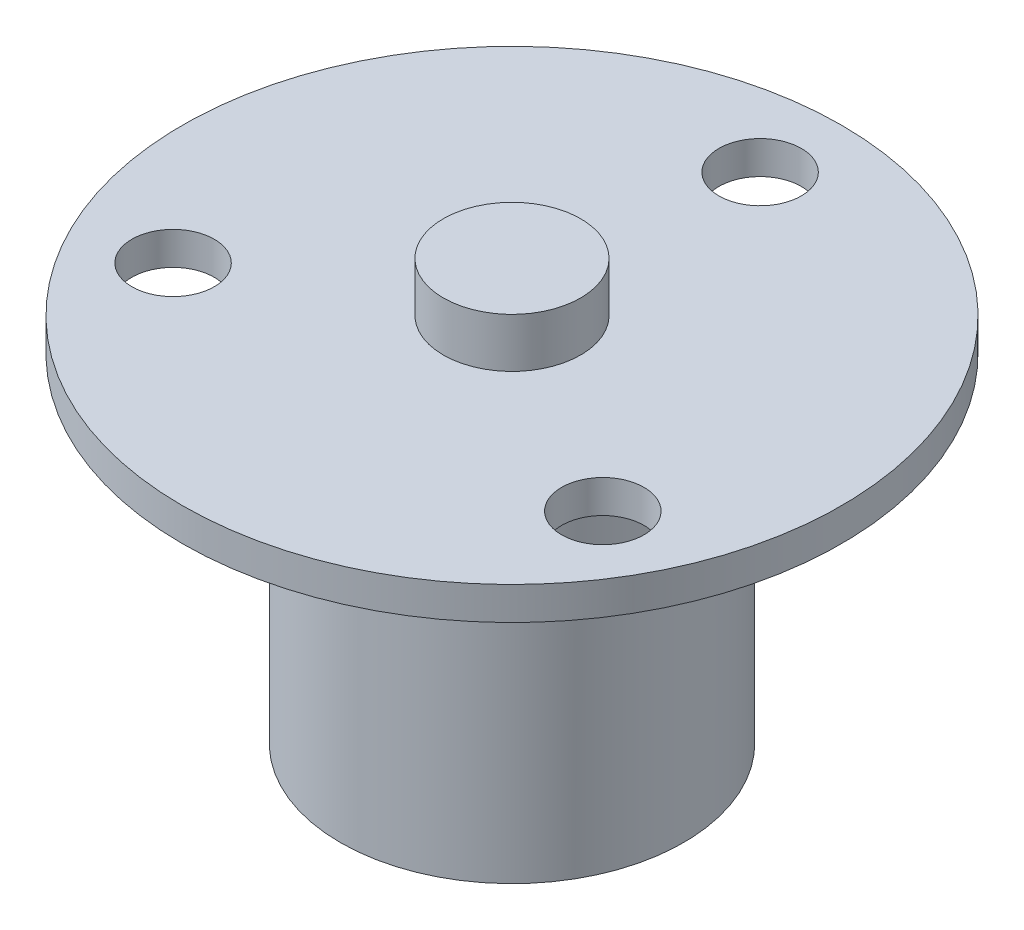
ISO-10303-21;
HEADER;
FILE_DESCRIPTION(('STEP AP214'),'2;1');
FILE_NAME('part.step','',(''),(''),'','','');
FILE_SCHEMA(('AUTOMOTIVE_DESIGN { 1 0 10303 214 1 1 1 1 }'));
ENDSEC;
DATA;
#1=APPLICATION_CONTEXT('core data for automotive mechanical design processes');
#2=APPLICATION_PROTOCOL_DEFINITION('international standard','automotive_design',2000,#1);
#3=PRODUCT_CONTEXT('',#1,'mechanical');
#4=PRODUCT('Part','Part','',(#3));
#5=PRODUCT_RELATED_PRODUCT_CATEGORY('part','',(#4));
#6=PRODUCT_DEFINITION_FORMATION('','',#4);
#7=PRODUCT_DEFINITION_CONTEXT('part definition',#1,'design');
#8=PRODUCT_DEFINITION('design','',#6,#7);
#9=PRODUCT_DEFINITION_SHAPE('','',#8);
#10=(LENGTH_UNIT() NAMED_UNIT(*) SI_UNIT(.MILLI.,.METRE.));
#11=(NAMED_UNIT(*) PLANE_ANGLE_UNIT() SI_UNIT($,.RADIAN.));
#12=(NAMED_UNIT(*) SI_UNIT($,.STERADIAN.) SOLID_ANGLE_UNIT());
#13=UNCERTAINTY_MEASURE_WITH_UNIT(LENGTH_MEASURE(1.E-05),#10,'distance_accuracy_value','');
#14=(GEOMETRIC_REPRESENTATION_CONTEXT(3) GLOBAL_UNCERTAINTY_ASSIGNED_CONTEXT((#13)) GLOBAL_UNIT_ASSIGNED_CONTEXT((#10,
#11,#12)) REPRESENTATION_CONTEXT('',''));
#15=CARTESIAN_POINT('',(0.,0.,0.));
#16=DIRECTION('',(0.,0.,1.));
#17=DIRECTION('',(1.,0.,0.));
#18=AXIS2_PLACEMENT_3D('',#15,#16,#17);
#19=CARTESIAN_POINT('',(0.,1.2,0.));
#20=DIRECTION('',(0.,1.,0.));
#21=DIRECTION('',(0.,0.,1.));
#22=AXIS2_PLACEMENT_3D('',#19,#20,#21);
#23=PLANE('',#22);
#24=CARTESIAN_POINT('',(-7.82407967333507,1.2,4.51723450556106));
#25=DIRECTION('',(0.,1.,0.));
#26=DIRECTION('',(0.,0.,1.));
#27=AXIS2_PLACEMENT_3D('',#24,#25,#26);
#28=CIRCLE('',#27,1.5);
#29=CARTESIAN_POINT('',(-7.82407967333507,1.2,6.01723450556106));
#30=VERTEX_POINT('',#29);
#31=EDGE_CURVE('E63',#30,#30,#28,.T.);
#32=ORIENTED_EDGE('',*,*,#31,.F.);
#33=EDGE_LOOP('',(#32));
#34=FACE_BOUND('',#33,.T.);
#35=CARTESIAN_POINT('',(7.82407967333507,1.2,4.51723450556105));
#36=DIRECTION('',(0.,1.,0.));
#37=DIRECTION('',(0.,0.,1.));
#38=AXIS2_PLACEMENT_3D('',#35,#36,#37);
#39=CIRCLE('',#38,1.5);
#40=CARTESIAN_POINT('',(7.82407967333507,1.2,6.01723450556105));
#41=VERTEX_POINT('',#40);
#42=EDGE_CURVE('E57',#41,#41,#39,.T.);
#43=ORIENTED_EDGE('',*,*,#42,.F.);
#44=EDGE_LOOP('',(#43));
#45=FACE_BOUND('',#44,.T.);
#46=CARTESIAN_POINT('',(0.,1.2,-9.03446901112215));
#47=DIRECTION('',(0.,1.,0.));
#48=DIRECTION('',(0.,0.,1.));
#49=AXIS2_PLACEMENT_3D('',#46,#47,#48);
#50=CIRCLE('',#49,1.5);
#51=CARTESIAN_POINT('',(0.,1.2,-7.53446901112215));
#52=VERTEX_POINT('',#51);
#53=EDGE_CURVE('E51',#52,#52,#50,.T.);
#54=ORIENTED_EDGE('',*,*,#53,.F.);
#55=EDGE_LOOP('',(#54));
#56=FACE_BOUND('',#55,.T.);
#57=CARTESIAN_POINT('',(0.,1.2,0.));
#58=DIRECTION('',(0.,1.,0.));
#59=DIRECTION('',(0.,0.,1.));
#60=AXIS2_PLACEMENT_3D('',#57,#58,#59);
#61=CIRCLE('',#60,12.);
#62=CARTESIAN_POINT('',(0.,1.2,12.));
#63=VERTEX_POINT('',#62);
#64=EDGE_CURVE('E37',#63,#63,#61,.T.);
#65=ORIENTED_EDGE('',*,*,#64,.T.);
#66=EDGE_LOOP('',(#65));
#67=FACE_BOUND('',#66,.T.);
#68=CARTESIAN_POINT('',(0.,1.2,0.));
#69=DIRECTION('',(0.,1.,0.));
#70=DIRECTION('',(0.,0.,1.));
#71=AXIS2_PLACEMENT_3D('',#68,#69,#70);
#72=CIRCLE('',#71,2.5);
#73=CARTESIAN_POINT('',(0.,1.2,2.5));
#74=VERTEX_POINT('',#73);
#75=EDGE_CURVE('E46',#74,#74,#72,.T.);
#76=ORIENTED_EDGE('',*,*,#75,.F.);
#77=EDGE_LOOP('',(#76));
#78=FACE_BOUND('',#77,.T.);
#79=ADVANCED_FACE('F30',(#34,#45,#56,#67,#78),#23,.T.);
#80=CARTESIAN_POINT('',(0.,0.,0.));
#81=DIRECTION('',(0.,1.,0.));
#82=DIRECTION('',(0.,0.,1.));
#83=AXIS2_PLACEMENT_3D('',#80,#81,#82);
#84=PLANE('',#83);
#85=CARTESIAN_POINT('',(0.,0.,0.));
#86=DIRECTION('',(0.,1.,0.));
#87=DIRECTION('',(0.,0.,1.));
#88=AXIS2_PLACEMENT_3D('',#85,#86,#87);
#89=CIRCLE('',#88,6.25);
#90=CARTESIAN_POINT('',(0.,0.,6.25));
#91=VERTEX_POINT('',#90);
#92=EDGE_CURVE('E10',#91,#91,#89,.F.);
#93=ORIENTED_EDGE('',*,*,#92,.F.);
#94=EDGE_LOOP('',(#93));
#95=FACE_BOUND('',#94,.T.);
#96=CARTESIAN_POINT('',(-7.82407967333507,0.,4.51723450556106));
#97=DIRECTION('',(0.,1.,0.));
#98=DIRECTION('',(0.,0.,1.));
#99=AXIS2_PLACEMENT_3D('',#96,#97,#98);
#100=CIRCLE('',#99,1.5);
#101=CARTESIAN_POINT('',(-7.82407967333507,0.,6.01723450556106));
#102=VERTEX_POINT('',#101);
#103=EDGE_CURVE('E60',#102,#102,#100,.T.);
#104=ORIENTED_EDGE('',*,*,#103,.T.);
#105=EDGE_LOOP('',(#104));
#106=FACE_BOUND('',#105,.T.);
#107=CARTESIAN_POINT('',(7.82407967333507,0.,4.51723450556105));
#108=DIRECTION('',(0.,1.,0.));
#109=DIRECTION('',(0.,0.,1.));
#110=AXIS2_PLACEMENT_3D('',#107,#108,#109);
#111=CIRCLE('',#110,1.5);
#112=CARTESIAN_POINT('',(7.82407967333507,0.,6.01723450556105));
#113=VERTEX_POINT('',#112);
#114=EDGE_CURVE('E54',#113,#113,#111,.T.);
#115=ORIENTED_EDGE('',*,*,#114,.T.);
#116=EDGE_LOOP('',(#115));
#117=FACE_BOUND('',#116,.T.);
#118=CARTESIAN_POINT('',(0.,0.,-9.03446901112215));
#119=DIRECTION('',(0.,1.,0.));
#120=DIRECTION('',(0.,0.,1.));
#121=AXIS2_PLACEMENT_3D('',#118,#119,#120);
#122=CIRCLE('',#121,1.5);
#123=CARTESIAN_POINT('',(0.,0.,-7.53446901112215));
#124=VERTEX_POINT('',#123);
#125=EDGE_CURVE('E50',#124,#124,#122,.T.);
#126=ORIENTED_EDGE('',*,*,#125,.T.);
#127=EDGE_LOOP('',(#126));
#128=FACE_BOUND('',#127,.T.);
#129=CARTESIAN_POINT('',(0.,0.,0.));
#130=DIRECTION('',(0.,1.,0.));
#131=DIRECTION('',(0.,0.,1.));
#132=AXIS2_PLACEMENT_3D('',#129,#130,#131);
#133=CIRCLE('',#132,12.);
#134=CARTESIAN_POINT('',(0.,0.,12.));
#135=VERTEX_POINT('',#134);
#136=EDGE_CURVE('E41',#135,#135,#133,.T.);
#137=ORIENTED_EDGE('',*,*,#136,.F.);
#138=EDGE_LOOP('',(#137));
#139=FACE_BOUND('',#138,.T.);
#140=ADVANCED_FACE('F91',(#95,#106,#117,#128,#139),#84,.F.);
#141=CARTESIAN_POINT('',(0.,1.2,0.));
#142=DIRECTION('',(0.,-1.,0.));
#143=DIRECTION('',(0.,0.,-1.));
#144=AXIS2_PLACEMENT_3D('',#141,#142,#143);
#145=CYLINDRICAL_SURFACE('',#144,12.);
#146=ORIENTED_EDGE('',*,*,#64,.F.);
#147=EDGE_LOOP('',(#146));
#148=FACE_BOUND('',#147,.T.);
#149=ORIENTED_EDGE('',*,*,#136,.T.);
#150=EDGE_LOOP('',(#149));
#151=FACE_BOUND('',#150,.T.);
#152=ADVANCED_FACE('F32',(#148,#151),#145,.T.);
#153=CARTESIAN_POINT('',(0.,0.,-9.03446901112215));
#154=DIRECTION('',(0.,1.,0.));
#155=DIRECTION('',(0.,0.,1.));
#156=AXIS2_PLACEMENT_3D('',#153,#154,#155);
#157=CYLINDRICAL_SURFACE('',#156,1.5);
#158=ORIENTED_EDGE('',*,*,#125,.F.);
#159=EDGE_LOOP('',(#158));
#160=FACE_BOUND('',#159,.T.);
#161=ORIENTED_EDGE('',*,*,#53,.T.);
#162=EDGE_LOOP('',(#161));
#163=FACE_BOUND('',#162,.T.);
#164=ADVANCED_FACE('F101',(#160,#163),#157,.F.);
#165=CARTESIAN_POINT('',(7.82407967333507,0.,4.51723450556105));
#166=DIRECTION('',(0.,1.,0.));
#167=DIRECTION('',(0.,0.,1.));
#168=AXIS2_PLACEMENT_3D('',#165,#166,#167);
#169=CYLINDRICAL_SURFACE('',#168,1.5);
#170=ORIENTED_EDGE('',*,*,#114,.F.);
#171=EDGE_LOOP('',(#170));
#172=FACE_BOUND('',#171,.T.);
#173=ORIENTED_EDGE('',*,*,#42,.T.);
#174=EDGE_LOOP('',(#173));
#175=FACE_BOUND('',#174,.T.);
#176=ADVANCED_FACE('F104',(#172,#175),#169,.F.);
#177=CARTESIAN_POINT('',(-7.82407967333507,0.,4.51723450556106));
#178=DIRECTION('',(0.,1.,0.));
#179=DIRECTION('',(0.,0.,1.));
#180=AXIS2_PLACEMENT_3D('',#177,#178,#179);
#181=CYLINDRICAL_SURFACE('',#180,1.5);
#182=ORIENTED_EDGE('',*,*,#103,.F.);
#183=EDGE_LOOP('',(#182));
#184=FACE_BOUND('',#183,.T.);
#185=ORIENTED_EDGE('',*,*,#31,.T.);
#186=EDGE_LOOP('',(#185));
#187=FACE_BOUND('',#186,.T.);
#188=ADVANCED_FACE('F108',(#184,#187),#181,.F.);
#189=CARTESIAN_POINT('',(0.,-12.3,0.));
#190=DIRECTION('',(0.,1.,0.));
#191=DIRECTION('',(0.,0.,1.));
#192=AXIS2_PLACEMENT_3D('',#189,#190,#191);
#193=CYLINDRICAL_SURFACE('',#192,6.25);
#194=CARTESIAN_POINT('',(0.,-12.3,0.));
#195=DIRECTION('',(0.,-1.,0.));
#196=DIRECTION('',(0.,0.,-1.));
#197=AXIS2_PLACEMENT_3D('',#194,#195,#196);
#198=CIRCLE('',#197,6.25);
#199=CARTESIAN_POINT('',(0.,-12.3,-6.25));
#200=VERTEX_POINT('',#199);
#201=EDGE_CURVE('E66',#200,#200,#198,.T.);
#202=ORIENTED_EDGE('',*,*,#201,.F.);
#203=EDGE_LOOP('',(#202));
#204=FACE_BOUND('',#203,.T.);
#205=ORIENTED_EDGE('',*,*,#92,.T.);
#206=EDGE_LOOP('',(#205));
#207=FACE_BOUND('',#206,.T.);
#208=ADVANCED_FACE('F87',(#204,#207),#193,.T.);
#209=CARTESIAN_POINT('',(0.,-12.3,0.));
#210=DIRECTION('',(0.,-1.,0.));
#211=DIRECTION('',(0.,0.,-1.));
#212=AXIS2_PLACEMENT_3D('',#209,#210,#211);
#213=PLANE('',#212);
#214=ORIENTED_EDGE('',*,*,#201,.T.);
#215=EDGE_LOOP('',(#214));
#216=FACE_BOUND('',#215,.T.);
#217=ADVANCED_FACE('F79',(#216),#213,.T.);
#218=CARTESIAN_POINT('',(0.,3.,0.));
#219=DIRECTION('',(0.,-1.,0.));
#220=DIRECTION('',(0.,0.,-1.));
#221=AXIS2_PLACEMENT_3D('',#218,#219,#220);
#222=CYLINDRICAL_SURFACE('',#221,2.5);
#223=ORIENTED_EDGE('',*,*,#75,.T.);
#224=EDGE_LOOP('',(#223));
#225=FACE_BOUND('',#224,.T.);
#226=CARTESIAN_POINT('',(0.,3.,0.));
#227=DIRECTION('',(0.,1.,0.));
#228=DIRECTION('',(0.,0.,1.));
#229=AXIS2_PLACEMENT_3D('',#226,#227,#228);
#230=CIRCLE('',#229,2.5);
#231=CARTESIAN_POINT('',(0.,3.,2.5));
#232=VERTEX_POINT('',#231);
#233=EDGE_CURVE('E71',#232,#232,#230,.T.);
#234=ORIENTED_EDGE('',*,*,#233,.F.);
#235=EDGE_LOOP('',(#234));
#236=FACE_BOUND('',#235,.T.);
#237=ADVANCED_FACE('F77',(#225,#236),#222,.T.);
#238=CARTESIAN_POINT('',(0.,3.,0.));
#239=DIRECTION('',(0.,1.,0.));
#240=DIRECTION('',(0.,0.,1.));
#241=AXIS2_PLACEMENT_3D('',#238,#239,#240);
#242=PLANE('',#241);
#243=ORIENTED_EDGE('',*,*,#233,.T.);
#244=EDGE_LOOP('',(#243));
#245=FACE_BOUND('',#244,.T.);
#246=ADVANCED_FACE('F75',(#245),#242,.T.);
#247=CLOSED_SHELL('',(#79,#140,#152,#164,#176,#188,#208,#217,#237,#246));
#248=MANIFOLD_SOLID_BREP('B2',#247);
#249=ADVANCED_BREP_SHAPE_REPRESENTATION('',(#18,#248),#14);
#250=SHAPE_DEFINITION_REPRESENTATION(#9,#249);
ENDSEC;
END-ISO-10303-21;
